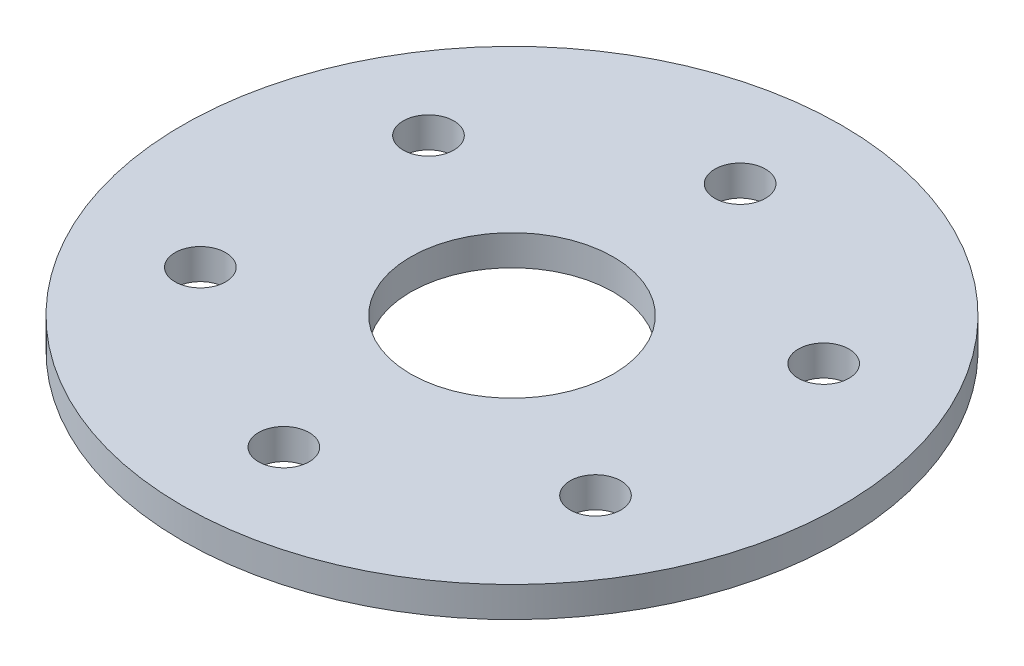
ISO-10303-21;
HEADER;
FILE_DESCRIPTION(('STEP AP214'),'2;1');
FILE_NAME('part.step','',(''),(''),'','','');
FILE_SCHEMA(('AUTOMOTIVE_DESIGN { 1 0 10303 214 1 1 1 1 }'));
ENDSEC;
DATA;
#1=APPLICATION_CONTEXT('core data for automotive mechanical design processes');
#2=APPLICATION_PROTOCOL_DEFINITION('international standard','automotive_design',2000,#1);
#3=PRODUCT_CONTEXT('',#1,'mechanical');
#4=PRODUCT('Part','Part','',(#3));
#5=PRODUCT_RELATED_PRODUCT_CATEGORY('part','',(#4));
#6=PRODUCT_DEFINITION_FORMATION('','',#4);
#7=PRODUCT_DEFINITION_CONTEXT('part definition',#1,'design');
#8=PRODUCT_DEFINITION('design','',#6,#7);
#9=PRODUCT_DEFINITION_SHAPE('','',#8);
#10=(LENGTH_UNIT() NAMED_UNIT(*) SI_UNIT(.MILLI.,.METRE.));
#11=(NAMED_UNIT(*) PLANE_ANGLE_UNIT() SI_UNIT($,.RADIAN.));
#12=(NAMED_UNIT(*) SI_UNIT($,.STERADIAN.) SOLID_ANGLE_UNIT());
#13=UNCERTAINTY_MEASURE_WITH_UNIT(LENGTH_MEASURE(1.E-05),#10,'distance_accuracy_value','');
#14=(GEOMETRIC_REPRESENTATION_CONTEXT(3) GLOBAL_UNCERTAINTY_ASSIGNED_CONTEXT((#13)) GLOBAL_UNIT_ASSIGNED_CONTEXT((#10,
#11,#12)) REPRESENTATION_CONTEXT('',''));
#15=CARTESIAN_POINT('',(0.,0.,0.));
#16=DIRECTION('',(0.,0.,1.));
#17=DIRECTION('',(1.,0.,0.));
#18=AXIS2_PLACEMENT_3D('',#15,#16,#17);
#19=CARTESIAN_POINT('',(0.,3.,0.));
#20=DIRECTION('',(0.,1.,0.));
#21=DIRECTION('',(0.,0.,1.));
#22=AXIS2_PLACEMENT_3D('',#19,#20,#21);
#23=PLANE('',#22);
#24=CARTESIAN_POINT('',(0.,3.,-22.5));
#25=DIRECTION('',(0.,1.,0.));
#26=DIRECTION('',(0.,0.,1.));
#27=AXIS2_PLACEMENT_3D('',#24,#25,#26);
#28=CIRCLE('',#27,2.5);
#29=CARTESIAN_POINT('',(0.,3.,-20.));
#30=VERTEX_POINT('',#29);
#31=EDGE_CURVE('E83',#30,#30,#28,.T.);
#32=ORIENTED_EDGE('',*,*,#31,.F.);
#33=EDGE_LOOP('',(#32));
#34=FACE_BOUND('',#33,.T.);
#35=CARTESIAN_POINT('',(-19.4855715851499,3.,-11.25));
#36=DIRECTION('',(0.,1.,0.));
#37=DIRECTION('',(0.,0.,1.));
#38=AXIS2_PLACEMENT_3D('',#35,#36,#37);
#39=CIRCLE('',#38,2.5);
#40=CARTESIAN_POINT('',(-19.4855715851499,3.,-8.74999999999999));
#41=VERTEX_POINT('',#40);
#42=EDGE_CURVE('E62',#41,#41,#39,.T.);
#43=ORIENTED_EDGE('',*,*,#42,.F.);
#44=EDGE_LOOP('',(#43));
#45=FACE_BOUND('',#44,.T.);
#46=CARTESIAN_POINT('',(-19.4855715851499,3.,11.25));
#47=DIRECTION('',(0.,1.,0.));
#48=DIRECTION('',(0.,0.,1.));
#49=AXIS2_PLACEMENT_3D('',#46,#47,#48);
#50=CIRCLE('',#49,2.5);
#51=CARTESIAN_POINT('',(-19.4855715851499,3.,13.75));
#52=VERTEX_POINT('',#51);
#53=EDGE_CURVE('E61',#52,#52,#50,.T.);
#54=ORIENTED_EDGE('',*,*,#53,.F.);
#55=EDGE_LOOP('',(#54));
#56=FACE_BOUND('',#55,.T.);
#57=CARTESIAN_POINT('',(0.,3.,22.5));
#58=DIRECTION('',(0.,1.,0.));
#59=DIRECTION('',(0.,0.,1.));
#60=AXIS2_PLACEMENT_3D('',#57,#58,#59);
#61=CIRCLE('',#60,2.5);
#62=CARTESIAN_POINT('',(0.,3.,25.));
#63=VERTEX_POINT('',#62);
#64=EDGE_CURVE('E68',#63,#63,#61,.T.);
#65=ORIENTED_EDGE('',*,*,#64,.F.);
#66=EDGE_LOOP('',(#65));
#67=FACE_BOUND('',#66,.T.);
#68=CARTESIAN_POINT('',(19.4855715851499,3.,11.25));
#69=DIRECTION('',(0.,1.,0.));
#70=DIRECTION('',(0.,0.,1.));
#71=AXIS2_PLACEMENT_3D('',#68,#69,#70);
#72=CIRCLE('',#71,2.5);
#73=CARTESIAN_POINT('',(19.4855715851499,3.,13.75));
#74=VERTEX_POINT('',#73);
#75=EDGE_CURVE('E74',#74,#74,#72,.T.);
#76=ORIENTED_EDGE('',*,*,#75,.F.);
#77=EDGE_LOOP('',(#76));
#78=FACE_BOUND('',#77,.T.);
#79=CARTESIAN_POINT('',(19.4855715851499,3.,-11.25));
#80=DIRECTION('',(0.,1.,0.));
#81=DIRECTION('',(0.,0.,1.));
#82=AXIS2_PLACEMENT_3D('',#79,#80,#81);
#83=CIRCLE('',#82,2.5);
#84=CARTESIAN_POINT('',(19.4855715851499,3.,-8.75000000000001));
#85=VERTEX_POINT('',#84);
#86=EDGE_CURVE('E80',#85,#85,#83,.T.);
#87=ORIENTED_EDGE('',*,*,#86,.F.);
#88=EDGE_LOOP('',(#87));
#89=FACE_BOUND('',#88,.T.);
#90=CARTESIAN_POINT('',(0.,3.,0.));
#91=DIRECTION('',(0.,1.,0.));
#92=DIRECTION('',(0.,0.,1.));
#93=AXIS2_PLACEMENT_3D('',#90,#91,#92);
#94=CIRCLE('',#93,32.5);
#95=CARTESIAN_POINT('',(0.,3.,32.5));
#96=VERTEX_POINT('',#95);
#97=EDGE_CURVE('E10',#96,#96,#94,.T.);
#98=ORIENTED_EDGE('',*,*,#97,.T.);
#99=EDGE_LOOP('',(#98));
#100=FACE_BOUND('',#99,.T.);
#101=CARTESIAN_POINT('',(0.,3.,0.));
#102=DIRECTION('',(0.,1.,0.));
#103=DIRECTION('',(0.,0.,1.));
#104=AXIS2_PLACEMENT_3D('',#101,#102,#103);
#105=CIRCLE('',#104,10.);
#106=CARTESIAN_POINT('',(0.,3.,10.));
#107=VERTEX_POINT('',#106);
#108=EDGE_CURVE('E50',#107,#107,#105,.T.);
#109=ORIENTED_EDGE('',*,*,#108,.F.);
#110=EDGE_LOOP('',(#109));
#111=FACE_BOUND('',#110,.T.);
#112=ADVANCED_FACE('F39',(#34,#45,#56,#67,#78,#89,#100,#111),#23,.T.);
#113=CARTESIAN_POINT('',(0.,0.,0.));
#114=DIRECTION('',(0.,1.,0.));
#115=DIRECTION('',(0.,0.,1.));
#116=AXIS2_PLACEMENT_3D('',#113,#114,#115);
#117=PLANE('',#116);
#118=CARTESIAN_POINT('',(0.,0.,-22.5));
#119=DIRECTION('',(0.,1.,0.));
#120=DIRECTION('',(0.,0.,1.));
#121=AXIS2_PLACEMENT_3D('',#118,#119,#120);
#122=CIRCLE('',#121,2.5);
#123=CARTESIAN_POINT('',(0.,0.,-20.));
#124=VERTEX_POINT('',#123);
#125=EDGE_CURVE('E55',#124,#124,#122,.T.);
#126=ORIENTED_EDGE('',*,*,#125,.T.);
#127=EDGE_LOOP('',(#126));
#128=FACE_BOUND('',#127,.T.);
#129=CARTESIAN_POINT('',(-19.4855715851499,0.,-11.25));
#130=DIRECTION('',(0.,1.,0.));
#131=DIRECTION('',(0.,0.,1.));
#132=AXIS2_PLACEMENT_3D('',#129,#130,#131);
#133=CIRCLE('',#132,2.5);
#134=CARTESIAN_POINT('',(-19.4855715851499,0.,-8.74999999999999));
#135=VERTEX_POINT('',#134);
#136=EDGE_CURVE('E84',#135,#135,#133,.T.);
#137=ORIENTED_EDGE('',*,*,#136,.T.);
#138=EDGE_LOOP('',(#137));
#139=FACE_BOUND('',#138,.T.);
#140=CARTESIAN_POINT('',(-19.4855715851499,0.,11.25));
#141=DIRECTION('',(0.,1.,0.));
#142=DIRECTION('',(0.,0.,1.));
#143=AXIS2_PLACEMENT_3D('',#140,#141,#142);
#144=CIRCLE('',#143,2.5);
#145=CARTESIAN_POINT('',(-19.4855715851499,0.,13.75));
#146=VERTEX_POINT('',#145);
#147=EDGE_CURVE('E58',#146,#146,#144,.T.);
#148=ORIENTED_EDGE('',*,*,#147,.T.);
#149=EDGE_LOOP('',(#148));
#150=FACE_BOUND('',#149,.T.);
#151=CARTESIAN_POINT('',(0.,0.,22.5));
#152=DIRECTION('',(0.,1.,0.));
#153=DIRECTION('',(0.,0.,1.));
#154=AXIS2_PLACEMENT_3D('',#151,#152,#153);
#155=CIRCLE('',#154,2.5);
#156=CARTESIAN_POINT('',(0.,0.,25.));
#157=VERTEX_POINT('',#156);
#158=EDGE_CURVE('E65',#157,#157,#155,.T.);
#159=ORIENTED_EDGE('',*,*,#158,.T.);
#160=EDGE_LOOP('',(#159));
#161=FACE_BOUND('',#160,.T.);
#162=CARTESIAN_POINT('',(19.4855715851499,0.,11.25));
#163=DIRECTION('',(0.,1.,0.));
#164=DIRECTION('',(0.,0.,1.));
#165=AXIS2_PLACEMENT_3D('',#162,#163,#164);
#166=CIRCLE('',#165,2.5);
#167=CARTESIAN_POINT('',(19.4855715851499,0.,13.75));
#168=VERTEX_POINT('',#167);
#169=EDGE_CURVE('E71',#168,#168,#166,.T.);
#170=ORIENTED_EDGE('',*,*,#169,.T.);
#171=EDGE_LOOP('',(#170));
#172=FACE_BOUND('',#171,.T.);
#173=CARTESIAN_POINT('',(19.4855715851499,0.,-11.25));
#174=DIRECTION('',(0.,1.,0.));
#175=DIRECTION('',(0.,0.,1.));
#176=AXIS2_PLACEMENT_3D('',#173,#174,#175);
#177=CIRCLE('',#176,2.5);
#178=CARTESIAN_POINT('',(19.4855715851499,0.,-8.75000000000001));
#179=VERTEX_POINT('',#178);
#180=EDGE_CURVE('E77',#179,#179,#177,.T.);
#181=ORIENTED_EDGE('',*,*,#180,.T.);
#182=EDGE_LOOP('',(#181));
#183=FACE_BOUND('',#182,.T.);
#184=CARTESIAN_POINT('',(0.,0.,0.));
#185=DIRECTION('',(0.,1.,0.));
#186=DIRECTION('',(0.,0.,1.));
#187=AXIS2_PLACEMENT_3D('',#184,#185,#186);
#188=CIRCLE('',#187,32.5);
#189=CARTESIAN_POINT('',(0.,0.,32.5));
#190=VERTEX_POINT('',#189);
#191=EDGE_CURVE('E43',#190,#190,#188,.T.);
#192=ORIENTED_EDGE('',*,*,#191,.F.);
#193=EDGE_LOOP('',(#192));
#194=FACE_BOUND('',#193,.T.);
#195=CARTESIAN_POINT('',(0.,0.,0.));
#196=DIRECTION('',(0.,1.,0.));
#197=DIRECTION('',(0.,0.,1.));
#198=AXIS2_PLACEMENT_3D('',#195,#196,#197);
#199=CIRCLE('',#198,10.);
#200=CARTESIAN_POINT('',(0.,0.,10.));
#201=VERTEX_POINT('',#200);
#202=EDGE_CURVE('E52',#201,#201,#199,.T.);
#203=ORIENTED_EDGE('',*,*,#202,.T.);
#204=EDGE_LOOP('',(#203));
#205=FACE_BOUND('',#204,.T.);
#206=ADVANCED_FACE('F94',(#128,#139,#150,#161,#172,#183,#194,#205),#117,.F.);
#207=CARTESIAN_POINT('',(0.,3.,0.));
#208=DIRECTION('',(0.,-1.,0.));
#209=DIRECTION('',(0.,0.,-1.));
#210=AXIS2_PLACEMENT_3D('',#207,#208,#209);
#211=CYLINDRICAL_SURFACE('',#210,32.5);
#212=ORIENTED_EDGE('',*,*,#97,.F.);
#213=EDGE_LOOP('',(#212));
#214=FACE_BOUND('',#213,.T.);
#215=ORIENTED_EDGE('',*,*,#191,.T.);
#216=EDGE_LOOP('',(#215));
#217=FACE_BOUND('',#216,.T.);
#218=ADVANCED_FACE('F41',(#214,#217),#211,.T.);
#219=CARTESIAN_POINT('',(0.,3.,0.));
#220=DIRECTION('',(0.,-1.,0.));
#221=DIRECTION('',(0.,0.,-1.));
#222=AXIS2_PLACEMENT_3D('',#219,#220,#221);
#223=CYLINDRICAL_SURFACE('',#222,10.);
#224=ORIENTED_EDGE('',*,*,#108,.T.);
#225=EDGE_LOOP('',(#224));
#226=FACE_BOUND('',#225,.T.);
#227=ORIENTED_EDGE('',*,*,#202,.F.);
#228=EDGE_LOOP('',(#227));
#229=FACE_BOUND('',#228,.T.);
#230=ADVANCED_FACE('F119',(#226,#229),#223,.F.);
#231=CARTESIAN_POINT('',(19.4855715851499,0.,-11.25));
#232=DIRECTION('',(0.,1.,0.));
#233=DIRECTION('',(0.,0.,1.));
#234=AXIS2_PLACEMENT_3D('',#231,#232,#233);
#235=CYLINDRICAL_SURFACE('',#234,2.5);
#236=ORIENTED_EDGE('',*,*,#180,.F.);
#237=EDGE_LOOP('',(#236));
#238=FACE_BOUND('',#237,.T.);
#239=ORIENTED_EDGE('',*,*,#86,.T.);
#240=EDGE_LOOP('',(#239));
#241=FACE_BOUND('',#240,.T.);
#242=ADVANCED_FACE('F122',(#238,#241),#235,.F.);
#243=CARTESIAN_POINT('',(19.4855715851499,0.,11.25));
#244=DIRECTION('',(0.,1.,0.));
#245=DIRECTION('',(0.,0.,1.));
#246=AXIS2_PLACEMENT_3D('',#243,#244,#245);
#247=CYLINDRICAL_SURFACE('',#246,2.5);
#248=ORIENTED_EDGE('',*,*,#169,.F.);
#249=EDGE_LOOP('',(#248));
#250=FACE_BOUND('',#249,.T.);
#251=ORIENTED_EDGE('',*,*,#75,.T.);
#252=EDGE_LOOP('',(#251));
#253=FACE_BOUND('',#252,.T.);
#254=ADVANCED_FACE('F140',(#250,#253),#247,.F.);
#255=CARTESIAN_POINT('',(0.,0.,22.5));
#256=DIRECTION('',(0.,1.,0.));
#257=DIRECTION('',(0.,0.,1.));
#258=AXIS2_PLACEMENT_3D('',#255,#256,#257);
#259=CYLINDRICAL_SURFACE('',#258,2.5);
#260=ORIENTED_EDGE('',*,*,#158,.F.);
#261=EDGE_LOOP('',(#260));
#262=FACE_BOUND('',#261,.T.);
#263=ORIENTED_EDGE('',*,*,#64,.T.);
#264=EDGE_LOOP('',(#263));
#265=FACE_BOUND('',#264,.T.);
#266=ADVANCED_FACE('F136',(#262,#265),#259,.F.);
#267=CARTESIAN_POINT('',(-19.4855715851499,0.,11.25));
#268=DIRECTION('',(0.,1.,0.));
#269=DIRECTION('',(0.,0.,1.));
#270=AXIS2_PLACEMENT_3D('',#267,#268,#269);
#271=CYLINDRICAL_SURFACE('',#270,2.5);
#272=ORIENTED_EDGE('',*,*,#147,.F.);
#273=EDGE_LOOP('',(#272));
#274=FACE_BOUND('',#273,.T.);
#275=ORIENTED_EDGE('',*,*,#53,.T.);
#276=EDGE_LOOP('',(#275));
#277=FACE_BOUND('',#276,.T.);
#278=ADVANCED_FACE('F133',(#274,#277),#271,.F.);
#279=CARTESIAN_POINT('',(-19.4855715851499,0.,-11.25));
#280=DIRECTION('',(0.,1.,0.));
#281=DIRECTION('',(0.,0.,1.));
#282=AXIS2_PLACEMENT_3D('',#279,#280,#281);
#283=CYLINDRICAL_SURFACE('',#282,2.5);
#284=ORIENTED_EDGE('',*,*,#136,.F.);
#285=EDGE_LOOP('',(#284));
#286=FACE_BOUND('',#285,.T.);
#287=ORIENTED_EDGE('',*,*,#42,.T.);
#288=EDGE_LOOP('',(#287));
#289=FACE_BOUND('',#288,.T.);
#290=ADVANCED_FACE('F100',(#286,#289),#283,.F.);
#291=CARTESIAN_POINT('',(0.,0.,-22.5));
#292=DIRECTION('',(0.,1.,0.));
#293=DIRECTION('',(0.,0.,1.));
#294=AXIS2_PLACEMENT_3D('',#291,#292,#293);
#295=CYLINDRICAL_SURFACE('',#294,2.5);
#296=ORIENTED_EDGE('',*,*,#125,.F.);
#297=EDGE_LOOP('',(#296));
#298=FACE_BOUND('',#297,.T.);
#299=ORIENTED_EDGE('',*,*,#31,.T.);
#300=EDGE_LOOP('',(#299));
#301=FACE_BOUND('',#300,.T.);
#302=ADVANCED_FACE('F97',(#298,#301),#295,.F.);
#303=CLOSED_SHELL('',(#112,#206,#218,#230,#242,#254,#266,#278,#290,#302));
#304=MANIFOLD_SOLID_BREP('B2',#303);
#305=ADVANCED_BREP_SHAPE_REPRESENTATION('',(#18,#304),#14);
#306=SHAPE_DEFINITION_REPRESENTATION(#9,#305);
ENDSEC;
END-ISO-10303-21;
